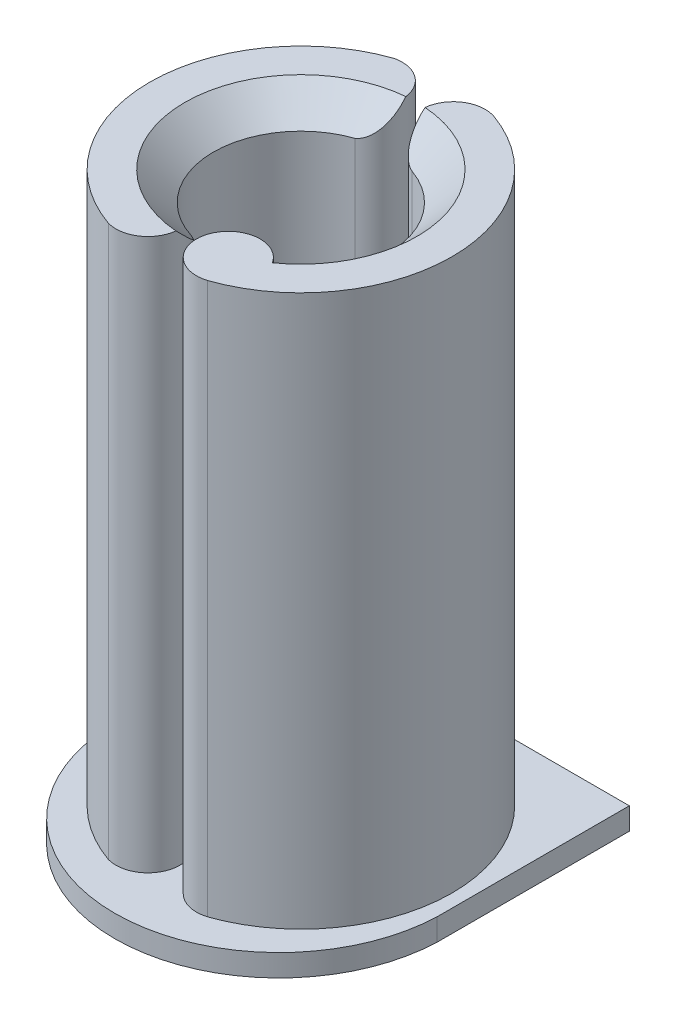
ISO-10303-21;
HEADER;
FILE_DESCRIPTION(('STEP AP214'),'2;1');
FILE_NAME('part.step','',(''),(''),'','','');
FILE_SCHEMA(('AUTOMOTIVE_DESIGN { 1 0 10303 214 1 1 1 1 }'));
ENDSEC;
DATA;
#1=APPLICATION_CONTEXT('core data for automotive mechanical design processes');
#2=APPLICATION_PROTOCOL_DEFINITION('international standard','automotive_design',2000,#1);
#3=PRODUCT_CONTEXT('',#1,'mechanical');
#4=PRODUCT('Part','Part','',(#3));
#5=PRODUCT_RELATED_PRODUCT_CATEGORY('part','',(#4));
#6=PRODUCT_DEFINITION_FORMATION('','',#4);
#7=PRODUCT_DEFINITION_CONTEXT('part definition',#1,'design');
#8=PRODUCT_DEFINITION('design','',#6,#7);
#9=PRODUCT_DEFINITION_SHAPE('','',#8);
#10=(LENGTH_UNIT() NAMED_UNIT(*) SI_UNIT(.MILLI.,.METRE.));
#11=(NAMED_UNIT(*) PLANE_ANGLE_UNIT() SI_UNIT($,.RADIAN.));
#12=(NAMED_UNIT(*) SI_UNIT($,.STERADIAN.) SOLID_ANGLE_UNIT());
#13=UNCERTAINTY_MEASURE_WITH_UNIT(LENGTH_MEASURE(1.E-05),#10,'distance_accuracy_value','');
#14=(GEOMETRIC_REPRESENTATION_CONTEXT(3) GLOBAL_UNCERTAINTY_ASSIGNED_CONTEXT((#13)) GLOBAL_UNIT_ASSIGNED_CONTEXT((#10,
#11,#12)) REPRESENTATION_CONTEXT('',''));
#15=CARTESIAN_POINT('',(0.,0.,0.));
#16=DIRECTION('',(0.,0.,1.));
#17=DIRECTION('',(1.,0.,0.));
#18=AXIS2_PLACEMENT_3D('',#15,#16,#17);
#19=CARTESIAN_POINT('',(0.,0.1,0.0990045452770166));
#20=DIRECTION('',(0.,-1.,0.));
#21=DIRECTION('',(0.,0.,-1.));
#22=AXIS2_PLACEMENT_3D('',#19,#20,#21);
#23=PLANE('',#22);
#24=CARTESIAN_POINT('',(0.181933513168552,0.1,-0.509708023179457));
#25=DIRECTION('',(0.,1.,0.));
#26=DIRECTION('',(0.,0.,1.));
#27=AXIS2_PLACEMENT_3D('',#24,#25,#26);
#28=CIRCLE('',#27,0.144595351835364);
#29=CARTESIAN_POINT('',(0.230541296487319,0.1,-0.645888415208663));
#30=VERTEX_POINT('',#29);
#31=CARTESIAN_POINT('',(0.130138984571206,0.0999999999999998,-0.374707495107262));
#32=VERTEX_POINT('',#31);
#33=EDGE_CURVE('E167',#30,#32,#28,.T.);
#34=ORIENTED_EDGE('',*,*,#33,.F.);
#35=CARTESIAN_POINT('',(0.,0.1,0.));
#36=DIRECTION('',(0.,1.,0.));
#37=DIRECTION('',(0.,0.,1.));
#38=AXIS2_PLACEMENT_3D('',#35,#36,#37);
#39=CIRCLE('',#38,0.68579963129679);
#40=CARTESIAN_POINT('',(0.225000000000004,0.0999999999999998,0.647839589934739));
#41=VERTEX_POINT('',#40);
#42=EDGE_CURVE('E174',#41,#30,#39,.T.);
#43=ORIENTED_EDGE('',*,*,#42,.F.);
#44=CARTESIAN_POINT('',(0.180878906412593,0.1,0.510091196386905));
#45=DIRECTION('',(0.,1.,0.));
#46=DIRECTION('',(0.,0.,-1.));
#47=AXIS2_PLACEMENT_3D('',#44,#45,#46);
#48=CIRCLE('',#47,0.144641940060129);
#49=CARTESIAN_POINT('',(0.136757812825181,0.0999999999999998,0.372342802839072));
#50=VERTEX_POINT('',#49);
#51=EDGE_CURVE('E154',#50,#41,#48,.T.);
#52=ORIENTED_EDGE('',*,*,#51,.F.);
#53=CARTESIAN_POINT('',(0.,0.1,0.));
#54=DIRECTION('',(0.,-1.,0.));
#55=DIRECTION('',(0.,0.,1.));
#56=AXIS2_PLACEMENT_3D('',#53,#54,#55);
#57=CIRCLE('',#56,0.396663411716765);
#58=EDGE_CURVE('E170',#32,#50,#57,.T.);
#59=ORIENTED_EDGE('',*,*,#58,.F.);
#60=EDGE_LOOP('',(#34,#43,#52,#59));
#61=FACE_BOUND('',#60,.T.);
#62=DIRECTION('',(0.,0.,-1.));
#63=VECTOR('',#62,1.);
#64=CARTESIAN_POINT('',(0.745,0.1,0.127313196762528));
#65=LINE('',#64,#63);
#66=CARTESIAN_POINT('',(0.745,0.1,0.127313196762528));
#67=VERTEX_POINT('',#66);
#68=CARTESIAN_POINT('',(0.745,0.1,-0.745));
#69=VERTEX_POINT('',#68);
#70=EDGE_CURVE('E209',#67,#69,#65,.T.);
#71=ORIENTED_EDGE('',*,*,#70,.T.);
#72=DIRECTION('',(-1.,0.,0.));
#73=VECTOR('',#72,1.);
#74=CARTESIAN_POINT('',(-0.745,0.1,-0.745));
#75=LINE('',#74,#73);
#76=CARTESIAN_POINT('',(-0.745,0.1,-0.745));
#77=VERTEX_POINT('',#76);
#78=EDGE_CURVE('E212',#69,#77,#75,.T.);
#79=ORIENTED_EDGE('',*,*,#78,.T.);
#80=DIRECTION('',(0.,0.,1.));
#81=VECTOR('',#80,1.);
#82=CARTESIAN_POINT('',(-0.745,0.1,0.127313196762528));
#83=LINE('',#82,#81);
#84=CARTESIAN_POINT('',(-0.745,0.1,0.127313196762528));
#85=VERTEX_POINT('',#84);
#86=EDGE_CURVE('E215',#77,#85,#83,.T.);
#87=ORIENTED_EDGE('',*,*,#86,.T.);
#88=CARTESIAN_POINT('',(0.,0.1,0.0990045452770166));
#89=DIRECTION('',(0.,1.,0.));
#90=DIRECTION('',(0.,0.,-1.));
#91=AXIS2_PLACEMENT_3D('',#88,#89,#90);
#92=CIRCLE('',#91,0.745537644756405);
#93=EDGE_CURVE('E217',#85,#67,#92,.T.);
#94=ORIENTED_EDGE('',*,*,#93,.T.);
#95=EDGE_LOOP('',(#71,#79,#87,#94));
#96=FACE_BOUND('',#95,.T.);
#97=CARTESIAN_POINT('',(-0.192449470211755,0.1,-0.506105604214357));
#98=DIRECTION('',(0.,1.,0.));
#99=DIRECTION('',(0.,0.,-1.));
#100=AXIS2_PLACEMENT_3D('',#97,#98,#99);
#101=CIRCLE('',#100,0.1454237246727);
#102=CARTESIAN_POINT('',(-0.130138984571207,0.1,-0.374707495107262));
#103=VERTEX_POINT('',#102);
#104=CARTESIAN_POINT('',(-0.225,0.0999999999999998,-0.64783958993474));
#105=VERTEX_POINT('',#104);
#106=EDGE_CURVE('E179',#103,#105,#101,.T.);
#107=ORIENTED_EDGE('',*,*,#106,.F.);
#108=CARTESIAN_POINT('',(0.,0.1,0.));
#109=DIRECTION('',(0.,-1.,0.));
#110=DIRECTION('',(0.,0.,1.));
#111=AXIS2_PLACEMENT_3D('',#108,#109,#110);
#112=CIRCLE('',#111,0.396663411716765);
#113=CARTESIAN_POINT('',(-0.120195023231292,0.0999999999999998,0.378014574567189));
#114=VERTEX_POINT('',#113);
#115=EDGE_CURVE('E183',#114,#103,#112,.T.);
#116=ORIENTED_EDGE('',*,*,#115,.F.);
#117=CARTESIAN_POINT('',(-0.186033792941878,0.1,0.507708184550411));
#118=DIRECTION('',(0.,1.,0.));
#119=DIRECTION('',(0.,0.,1.));
#120=AXIS2_PLACEMENT_3D('',#117,#118,#119);
#121=CIRCLE('',#120,0.145448190320415);
#122=CARTESIAN_POINT('',(-0.225,0.0999999999999998,0.64783958993474));
#123=VERTEX_POINT('',#122);
#124=EDGE_CURVE('E194',#123,#114,#121,.T.);
#125=ORIENTED_EDGE('',*,*,#124,.F.);
#126=CARTESIAN_POINT('',(0.,0.1,0.));
#127=DIRECTION('',(0.,1.,0.));
#128=DIRECTION('',(0.,0.,1.));
#129=AXIS2_PLACEMENT_3D('',#126,#127,#128);
#130=CIRCLE('',#129,0.68579963129679);
#131=EDGE_CURVE('E191',#105,#123,#130,.T.);
#132=ORIENTED_EDGE('',*,*,#131,.F.);
#133=EDGE_LOOP('',(#107,#116,#125,#132));
#134=FACE_BOUND('',#133,.T.);
#135=ADVANCED_FACE('F34',(#61,#96,#134),#23,.F.);
#136=CARTESIAN_POINT('',(0.745,0.1,0.127313196762528));
#137=DIRECTION('',(-1.,0.,0.));
#138=DIRECTION('',(0.,0.,1.));
#139=AXIS2_PLACEMENT_3D('',#136,#137,#138);
#140=PLANE('',#139);
#141=DIRECTION('',(0.,0.,-1.));
#142=VECTOR('',#141,1.);
#143=CARTESIAN_POINT('',(0.745,0.,0.127313196762528));
#144=LINE('',#143,#142);
#145=CARTESIAN_POINT('',(0.745,0.,0.127313196762528));
#146=VERTEX_POINT('',#145);
#147=CARTESIAN_POINT('',(0.745,0.,-0.745));
#148=VERTEX_POINT('',#147);
#149=EDGE_CURVE('E208',#146,#148,#144,.T.);
#150=ORIENTED_EDGE('',*,*,#149,.T.);
#151=DIRECTION('',(0.,-1.,0.));
#152=VECTOR('',#151,1.);
#153=CARTESIAN_POINT('',(0.745,0.1,-0.745));
#154=LINE('',#153,#152);
#155=EDGE_CURVE('E235',#69,#148,#154,.T.);
#156=ORIENTED_EDGE('',*,*,#155,.F.);
#157=ORIENTED_EDGE('',*,*,#70,.F.);
#158=DIRECTION('',(0.,-1.,0.));
#159=VECTOR('',#158,1.);
#160=CARTESIAN_POINT('',(0.745,0.1,0.127313196762528));
#161=LINE('',#160,#159);
#162=EDGE_CURVE('E219',#67,#146,#161,.T.);
#163=ORIENTED_EDGE('',*,*,#162,.T.);
#164=EDGE_LOOP('',(#150,#156,#157,#163));
#165=FACE_BOUND('',#164,.T.);
#166=ADVANCED_FACE('F264',(#165),#140,.F.);
#167=CARTESIAN_POINT('',(-0.745,0.1,-0.745));
#168=DIRECTION('',(0.,0.,1.));
#169=DIRECTION('',(1.,0.,0.));
#170=AXIS2_PLACEMENT_3D('',#167,#168,#169);
#171=PLANE('',#170);
#172=DIRECTION('',(-1.,0.,0.));
#173=VECTOR('',#172,1.);
#174=CARTESIAN_POINT('',(-0.745,0.,-0.745));
#175=LINE('',#174,#173);
#176=CARTESIAN_POINT('',(-0.745,0.,-0.745));
#177=VERTEX_POINT('',#176);
#178=EDGE_CURVE('E222',#148,#177,#175,.T.);
#179=ORIENTED_EDGE('',*,*,#178,.T.);
#180=DIRECTION('',(0.,-1.,0.));
#181=VECTOR('',#180,1.);
#182=CARTESIAN_POINT('',(-0.745,0.1,-0.745));
#183=LINE('',#182,#181);
#184=EDGE_CURVE('E232',#77,#177,#183,.T.);
#185=ORIENTED_EDGE('',*,*,#184,.F.);
#186=ORIENTED_EDGE('',*,*,#78,.F.);
#187=ORIENTED_EDGE('',*,*,#155,.T.);
#188=EDGE_LOOP('',(#179,#185,#186,#187));
#189=FACE_BOUND('',#188,.T.);
#190=ADVANCED_FACE('F276',(#189),#171,.F.);
#191=CARTESIAN_POINT('',(-0.745,0.1,0.127313196762528));
#192=DIRECTION('',(1.,0.,0.));
#193=DIRECTION('',(0.,0.,-1.));
#194=AXIS2_PLACEMENT_3D('',#191,#192,#193);
#195=PLANE('',#194);
#196=DIRECTION('',(0.,0.,1.));
#197=VECTOR('',#196,1.);
#198=CARTESIAN_POINT('',(-0.745,0.,0.127313196762528));
#199=LINE('',#198,#197);
#200=CARTESIAN_POINT('',(-0.745,0.,0.127313196762528));
#201=VERTEX_POINT('',#200);
#202=EDGE_CURVE('E224',#177,#201,#199,.T.);
#203=ORIENTED_EDGE('',*,*,#202,.T.);
#204=DIRECTION('',(0.,-1.,0.));
#205=VECTOR('',#204,1.);
#206=CARTESIAN_POINT('',(-0.745,0.1,0.127313196762528));
#207=LINE('',#206,#205);
#208=EDGE_CURVE('E229',#85,#201,#207,.T.);
#209=ORIENTED_EDGE('',*,*,#208,.F.);
#210=ORIENTED_EDGE('',*,*,#86,.F.);
#211=ORIENTED_EDGE('',*,*,#184,.T.);
#212=EDGE_LOOP('',(#203,#209,#210,#211));
#213=FACE_BOUND('',#212,.T.);
#214=ADVANCED_FACE('F272',(#213),#195,.F.);
#215=CARTESIAN_POINT('',(0.,0.1,0.0990045452770166));
#216=DIRECTION('',(0.,-1.,0.));
#217=DIRECTION('',(0.,0.,-1.));
#218=AXIS2_PLACEMENT_3D('',#215,#216,#217);
#219=CYLINDRICAL_SURFACE('',#218,0.745537644756405);
#220=CARTESIAN_POINT('',(0.,0.,0.0990045452770166));
#221=DIRECTION('',(0.,1.,0.));
#222=DIRECTION('',(0.,0.,-1.));
#223=AXIS2_PLACEMENT_3D('',#220,#221,#222);
#224=CIRCLE('',#223,0.745537644756405);
#225=EDGE_CURVE('E213',#201,#146,#224,.T.);
#226=ORIENTED_EDGE('',*,*,#225,.T.);
#227=ORIENTED_EDGE('',*,*,#162,.F.);
#228=ORIENTED_EDGE('',*,*,#93,.F.);
#229=ORIENTED_EDGE('',*,*,#208,.T.);
#230=EDGE_LOOP('',(#226,#227,#228,#229));
#231=FACE_BOUND('',#230,.T.);
#232=ADVANCED_FACE('F268',(#231),#219,.T.);
#233=CARTESIAN_POINT('',(0.,0.,0.0990045452770166));
#234=DIRECTION('',(0.,-1.,0.));
#235=DIRECTION('',(0.,0.,-1.));
#236=AXIS2_PLACEMENT_3D('',#233,#234,#235);
#237=PLANE('',#236);
#238=ORIENTED_EDGE('',*,*,#149,.F.);
#239=ORIENTED_EDGE('',*,*,#225,.F.);
#240=ORIENTED_EDGE('',*,*,#202,.F.);
#241=ORIENTED_EDGE('',*,*,#178,.F.);
#242=EDGE_LOOP('',(#238,#239,#240,#241));
#243=FACE_BOUND('',#242,.T.);
#244=ADVANCED_FACE('F259',(#243),#237,.T.);
#245=CARTESIAN_POINT('',(-0.192449470211755,2.6,-0.506105604214357));
#246=DIRECTION('',(0.,-1.,0.));
#247=DIRECTION('',(0.,0.,-1.));
#248=AXIS2_PLACEMENT_3D('',#245,#246,#247);
#249=CYLINDRICAL_SURFACE('',#248,0.1454237246727);
#250=CARTESIAN_POINT('',(-0.192449470211755,2.6,-0.506105604214357));
#251=DIRECTION('',(0.,1.,0.));
#252=DIRECTION('',(0.,0.,-1.));
#253=AXIS2_PLACEMENT_3D('',#250,#251,#252);
#254=CIRCLE('',#253,0.1454237246727);
#255=CARTESIAN_POINT('',(-0.0481879489078253,2.6,-0.524454259989562));
#256=VERTEX_POINT('',#255);
#257=CARTESIAN_POINT('',(-0.225,2.6,-0.64783958993474));
#258=VERTEX_POINT('',#257);
#259=EDGE_CURVE('E180',#256,#258,#254,.T.);
#260=ORIENTED_EDGE('',*,*,#259,.F.);
#261=CARTESIAN_POINT('',(-0.0481879489078253,2.6,-0.524454259989562));
#262=CARTESIAN_POINT('',(-0.0468113824389066,2.58884809631623,-0.513349456598553));
#263=CARTESIAN_POINT('',(-0.046651874035208,2.57759807362688,-0.502094265838497));
#264=CARTESIAN_POINT('',(-0.0490197110508591,2.55528063647417,-0.479459860878492));
#265=CARTESIAN_POINT('',(-0.0515754662528383,2.54421640782423,-0.468080592893677));
#266=CARTESIAN_POINT('',(-0.0580748725628018,2.52709764342816,-0.450039322379565));
#267=CARTESIAN_POINT('',(-0.0610770906540231,2.52078452191212,-0.443282515272577));
#268=CARTESIAN_POINT('',(-0.0683161363456795,2.50867707231127,-0.429971617518339));
#269=CARTESIAN_POINT('',(-0.0725502634742349,2.50288164532439,-0.423417117788652));
#270=CARTESIAN_POINT('',(-0.0810214041522569,2.49368072596869,-0.412483922962882));
#271=CARTESIAN_POINT('',(-0.0849139458669119,2.4900647346156,-0.408017339930513));
#272=CARTESIAN_POINT('',(-0.0934748798408047,2.48348479400758,-0.399387099754529));
#273=CARTESIAN_POINT('',(-0.0981394763147642,2.4805178119163,-0.395222097229538));
#274=CARTESIAN_POINT('',(-0.107203956174331,2.47602055561671,-0.388179109115445));
#275=CARTESIAN_POINT('',(-0.111450028382899,2.47431901777294,-0.385215547492988));
#276=CARTESIAN_POINT('',(-0.12044007758109,2.47159769773367,-0.379648642830556));
#277=CARTESIAN_POINT('',(-0.125189026335204,2.47058563600767,-0.377049629820146));
#278=CARTESIAN_POINT('',(-0.130138984571207,2.47,-0.374707495107262));
#279=B_SPLINE_CURVE_WITH_KNOTS('',3,(#261,#262,#263,#264,#265,#266,#267,#268,#269,#270,#271,
#272,#273,#274,#275,#276,#277,#278),.UNSPECIFIED.,.F.,.F.,(4,2,2,2,2,2,2,2,4),(0.,
0.0474622286653903,0.0954259904776514,0.124522262061889,0.153555226078874,0.17431701331885,
0.194979603103086,0.21125829110688,0.227716390323622),.UNSPECIFIED.);
#280=CARTESIAN_POINT('',(-0.130138984571207,2.47,-0.374707495107262));
#281=VERTEX_POINT('',#280);
#282=EDGE_CURVE('E241',#256,#281,#279,.T.);
#283=ORIENTED_EDGE('',*,*,#282,.T.);
#284=DIRECTION('',(0.,-1.,0.));
#285=VECTOR('',#284,1.);
#286=CARTESIAN_POINT('',(-0.130138984571207,2.6,-0.374707495107262));
#287=LINE('',#286,#285);
#288=EDGE_CURVE('E188',#281,#103,#287,.T.);
#289=ORIENTED_EDGE('',*,*,#288,.T.);
#290=ORIENTED_EDGE('',*,*,#106,.T.);
#291=DIRECTION('',(0.,-1.,0.));
#292=VECTOR('',#291,1.);
#293=CARTESIAN_POINT('',(-0.225,2.6,-0.64783958993474));
#294=LINE('',#293,#292);
#295=EDGE_CURVE('E205',#258,#105,#294,.T.);
#296=ORIENTED_EDGE('',*,*,#295,.F.);
#297=EDGE_LOOP('',(#260,#283,#289,#290,#296));
#298=FACE_BOUND('',#297,.T.);
#299=ADVANCED_FACE('F253',(#298),#249,.T.);
#300=CARTESIAN_POINT('',(0.,2.6,0.));
#301=DIRECTION('',(0.,-1.,0.));
#302=DIRECTION('',(0.,0.,-1.));
#303=AXIS2_PLACEMENT_3D('',#300,#301,#302);
#304=CYLINDRICAL_SURFACE('',#303,0.68579963129679);
#305=ORIENTED_EDGE('',*,*,#131,.T.);
#306=DIRECTION('',(0.,-1.,0.));
#307=VECTOR('',#306,1.);
#308=CARTESIAN_POINT('',(-0.225,2.6,0.64783958993474));
#309=LINE('',#308,#307);
#310=CARTESIAN_POINT('',(-0.225,2.6,0.64783958993474));
#311=VERTEX_POINT('',#310);
#312=EDGE_CURVE('E202',#311,#123,#309,.T.);
#313=ORIENTED_EDGE('',*,*,#312,.F.);
#314=CARTESIAN_POINT('',(0.,2.6,0.));
#315=DIRECTION('',(0.,1.,0.));
#316=DIRECTION('',(0.,0.,1.));
#317=AXIS2_PLACEMENT_3D('',#314,#315,#316);
#318=CIRCLE('',#317,0.68579963129679);
#319=EDGE_CURVE('E182',#258,#311,#318,.T.);
#320=ORIENTED_EDGE('',*,*,#319,.F.);
#321=ORIENTED_EDGE('',*,*,#295,.T.);
#322=EDGE_LOOP('',(#305,#313,#320,#321));
#323=FACE_BOUND('',#322,.T.);
#324=ADVANCED_FACE('F258',(#323),#304,.T.);
#325=CARTESIAN_POINT('',(-0.186033792941878,2.6,0.507708184550411));
#326=DIRECTION('',(0.,-1.,0.));
#327=DIRECTION('',(0.,0.,-1.));
#328=AXIS2_PLACEMENT_3D('',#325,#326,#327);
#329=CYLINDRICAL_SURFACE('',#328,0.145448190320415);
#330=DIRECTION('',(0.,-1.,0.));
#331=VECTOR('',#330,1.);
#332=CARTESIAN_POINT('',(-0.120195023231292,2.6,0.378014574567189));
#333=LINE('',#332,#331);
#334=CARTESIAN_POINT('',(-0.120195023231292,2.47,0.378014574567189));
#335=VERTEX_POINT('',#334);
#336=EDGE_CURVE('E200',#335,#114,#333,.T.);
#337=ORIENTED_EDGE('',*,*,#336,.F.);
#338=CARTESIAN_POINT('',(-0.120195023231292,2.47,0.378014574567189));
#339=CARTESIAN_POINT('',(-0.114052153159112,2.47110298514331,0.381127827107212));
#340=CARTESIAN_POINT('',(-0.108282690881142,2.47284977598417,0.384609048688318));
#341=CARTESIAN_POINT('',(-0.0976092900010662,2.47730731444981,0.392047193502122));
#342=CARTESIAN_POINT('',(-0.0926930042822843,2.4800022279407,0.395995635239962));
#343=CARTESIAN_POINT('',(-0.0824614481164727,2.48688305309949,0.405297706031217));
#344=CARTESIAN_POINT('',(-0.077379183991403,2.49127461906525,0.410748436956359));
#345=CARTESIAN_POINT('',(-0.0683069914917714,2.5007821979017,0.421987436870435));
#346=CARTESIAN_POINT('',(-0.0643255708396699,2.50590341362188,0.427777937206202));
#347=CARTESIAN_POINT('',(-0.0555734362158072,2.51933650289779,0.442572039270886));
#348=CARTESIAN_POINT('',(-0.0514501924760384,2.52793455863402,0.451696276653454));
#349=CARTESIAN_POINT('',(-0.0451907047431163,2.54560755524993,0.470120714153125));
#350=CARTESIAN_POINT('',(-0.0430536828834744,2.55468230796786,0.479420843928045));
#351=CARTESIAN_POINT('',(-0.0410292890548282,2.56984273003144,0.494809596541437));
#352=CARTESIAN_POINT('',(-0.0406182415893711,2.57587135560741,0.500891250467211));
#353=CARTESIAN_POINT('',(-0.0405569645383898,2.58793619090077,0.512998741690067));
#354=CARTESIAN_POINT('',(-0.040903443657669,2.59397225438052,0.519024706667983));
#355=CARTESIAN_POINT('',(-0.0416191038269021,2.6,0.525016380161408));
#356=B_SPLINE_CURVE_WITH_KNOTS('',3,(#338,#339,#340,#341,#342,#343,#344,#345,#346,#347,#348,
#349,#350,#351,#352,#353,#354,#355),.UNSPECIFIED.,.F.,.F.,(4,2,2,2,2,2,2,2,4),(0.,
0.0207839810619698,0.0412361593253994,0.0670474358072767,0.0930529445640032,0.132435447223801,
0.171802519959302,0.197490518209206,0.223067129332136),.UNSPECIFIED.);
#357=CARTESIAN_POINT('',(-0.0416191038269021,2.6,0.525016380161408));
#358=VERTEX_POINT('',#357);
#359=EDGE_CURVE('E308',#335,#358,#356,.T.);
#360=ORIENTED_EDGE('',*,*,#359,.T.);
#361=CARTESIAN_POINT('',(-0.186033792941878,2.6,0.507708184550411));
#362=DIRECTION('',(0.,1.,0.));
#363=DIRECTION('',(0.,0.,1.));
#364=AXIS2_PLACEMENT_3D('',#361,#362,#363);
#365=CIRCLE('',#364,0.145448190320415);
#366=EDGE_CURVE('E185',#311,#358,#365,.T.);
#367=ORIENTED_EDGE('',*,*,#366,.F.);
#368=ORIENTED_EDGE('',*,*,#312,.T.);
#369=ORIENTED_EDGE('',*,*,#124,.T.);
#370=EDGE_LOOP('',(#337,#360,#367,#368,#369));
#371=FACE_BOUND('',#370,.T.);
#372=ADVANCED_FACE('F306',(#371),#329,.T.);
#373=CARTESIAN_POINT('',(0.,2.6,0.));
#374=DIRECTION('',(0.,-1.,0.));
#375=DIRECTION('',(0.,0.,-1.));
#376=AXIS2_PLACEMENT_3D('',#373,#374,#375);
#377=CYLINDRICAL_SURFACE('',#376,0.396663411716765);
#378=ORIENTED_EDGE('',*,*,#288,.F.);
#379=CARTESIAN_POINT('',(0.,2.47,0.));
#380=DIRECTION('',(0.,-1.,0.));
#381=DIRECTION('',(0.,0.,-1.));
#382=AXIS2_PLACEMENT_3D('',#379,#380,#381);
#383=CIRCLE('',#382,0.396663411716765);
#384=EDGE_CURVE('E248',#281,#335,#383,.F.);
#385=ORIENTED_EDGE('',*,*,#384,.T.);
#386=ORIENTED_EDGE('',*,*,#336,.T.);
#387=ORIENTED_EDGE('',*,*,#115,.T.);
#388=EDGE_LOOP('',(#378,#385,#386,#387));
#389=FACE_BOUND('',#388,.T.);
#390=ADVANCED_FACE('F301',(#389),#377,.F.);
#391=CARTESIAN_POINT('',(-0.0962247351058775,2.6,-0.253052802107179));
#392=DIRECTION('',(0.,-1.,0.));
#393=DIRECTION('',(0.,0.,-1.));
#394=AXIS2_PLACEMENT_3D('',#391,#392,#393);
#395=PLANE('',#394);
#396=ORIENTED_EDGE('',*,*,#366,.T.);
#397=CARTESIAN_POINT('',(0.,2.6,0.));
#398=DIRECTION('',(0.,-1.,0.));
#399=DIRECTION('',(0.,0.,-1.));
#400=AXIS2_PLACEMENT_3D('',#397,#398,#399);
#401=CIRCLE('',#400,0.526663411716765);
#402=EDGE_CURVE('E238',#358,#256,#401,.T.);
#403=ORIENTED_EDGE('',*,*,#402,.T.);
#404=ORIENTED_EDGE('',*,*,#259,.T.);
#405=ORIENTED_EDGE('',*,*,#319,.T.);
#406=EDGE_LOOP('',(#396,#403,#404,#405));
#407=FACE_BOUND('',#406,.T.);
#408=ADVANCED_FACE('F322',(#407),#395,.F.);
#409=CARTESIAN_POINT('',(0.181933513168552,2.6,-0.509708023179457));
#410=DIRECTION('',(0.,-1.,0.));
#411=DIRECTION('',(0.,0.,-1.));
#412=AXIS2_PLACEMENT_3D('',#409,#410,#411);
#413=CYLINDRICAL_SURFACE('',#412,0.144595351835364);
#414=DIRECTION('',(0.,-1.,0.));
#415=VECTOR('',#414,1.);
#416=CARTESIAN_POINT('',(0.130138984571206,2.6,-0.374707495107262));
#417=LINE('',#416,#415);
#418=CARTESIAN_POINT('',(0.130138984571206,2.47,-0.374707495107262));
#419=VERTEX_POINT('',#418);
#420=EDGE_CURVE('E177',#419,#32,#417,.T.);
#421=ORIENTED_EDGE('',*,*,#420,.F.);
#422=CARTESIAN_POINT('',(0.130138984571206,2.47,-0.374707495107262));
#423=CARTESIAN_POINT('',(0.12434889210717,2.47018165213305,-0.376917584674864));
#424=CARTESIAN_POINT('',(0.118760310354285,2.47093813951965,-0.379498869807198));
#425=CARTESIAN_POINT('',(0.108183921731321,2.47339422824173,-0.385194889781053));
#426=CARTESIAN_POINT('',(0.103188757631626,2.47508038699691,-0.388301593394116));
#427=CARTESIAN_POINT('',(0.0938589630864294,2.47919104310815,-0.394888758853906));
#428=CARTESIAN_POINT('',(0.0895200559172997,2.48161042114231,-0.398366524203718));
#429=CARTESIAN_POINT('',(0.081439837488211,2.48700614353651,-0.405600917670387));
#430=CARTESIAN_POINT('',(0.0777009852997231,2.48998467642714,-0.409358605302374));
#431=CARTESIAN_POINT('',(0.0684947106709694,2.49846502222207,-0.419630182300225));
#432=CARTESIAN_POINT('',(0.0635407550886215,2.50432338860623,-0.426308592195388));
#433=CARTESIAN_POINT('',(0.0550231042896109,2.5166832472287,-0.439948648534949));
#434=CARTESIAN_POINT('',(0.0514631632648259,2.52318641782063,-0.446911004813412));
#435=CARTESIAN_POINT('',(0.0442165750405,2.53965480909225,-0.464249031244205));
#436=CARTESIAN_POINT('',(0.0412305208158479,2.54983201123458,-0.474716263513771));
#437=CARTESIAN_POINT('',(0.0376237174156314,2.57047631176065,-0.495720447852139));
#438=CARTESIAN_POINT('',(0.0369993629989501,2.58094294369018,-0.506257269035531));
#439=CARTESIAN_POINT('',(0.037647233659945,2.59427571773224,-0.519576710475071));
#440=CARTESIAN_POINT('',(0.0378711269388299,2.59713928488338,-0.522431380974029));
#441=CARTESIAN_POINT('',(0.038178864149872,2.6,-0.525277758498651));
#442=B_SPLINE_CURVE_WITH_KNOTS('',3,(#422,#423,#424,#425,#426,#427,#428,#429,#430,#431,#432,
#433,#434,#435,#436,#437,#438,#439,#440,#441),.UNSPECIFIED.,.F.,.F.,(4,2,2,2,2,2,2,2,2,4),(0.,
0.0185050415963094,0.0367492719269501,0.054868946598638,0.0730610789155196,0.10340436486666,
0.133828814754669,0.178302462998467,0.222708192752617,0.234853049338382),.UNSPECIFIED.);
#443=CARTESIAN_POINT('',(0.0381788641498753,2.6,-0.525277758498651));
#444=VERTEX_POINT('',#443);
#445=EDGE_CURVE('E48',#419,#444,#442,.T.);
#446=ORIENTED_EDGE('',*,*,#445,.T.);
#447=CARTESIAN_POINT('',(0.181933513168552,2.6,-0.509708023179457));
#448=DIRECTION('',(0.,1.,0.));
#449=DIRECTION('',(0.,0.,1.));
#450=AXIS2_PLACEMENT_3D('',#447,#448,#449);
#451=CIRCLE('',#450,0.144595351835364);
#452=CARTESIAN_POINT('',(0.230541296487319,2.6,-0.645888415208663));
#453=VERTEX_POINT('',#452);
#454=EDGE_CURVE('E147',#453,#444,#451,.T.);
#455=ORIENTED_EDGE('',*,*,#454,.F.);
#456=DIRECTION('',(0.,-1.,0.));
#457=VECTOR('',#456,1.);
#458=CARTESIAN_POINT('',(0.230541296487319,2.6,-0.645888415208663));
#459=LINE('',#458,#457);
#460=EDGE_CURVE('E158',#453,#30,#459,.T.);
#461=ORIENTED_EDGE('',*,*,#460,.T.);
#462=ORIENTED_EDGE('',*,*,#33,.T.);
#463=EDGE_LOOP('',(#421,#446,#455,#461,#462));
#464=FACE_BOUND('',#463,.T.);
#465=ADVANCED_FACE('F325',(#464),#413,.T.);
#466=CARTESIAN_POINT('',(0.,2.6,0.));
#467=DIRECTION('',(0.,-1.,0.));
#468=DIRECTION('',(0.,0.,-1.));
#469=AXIS2_PLACEMENT_3D('',#466,#467,#468);
#470=CYLINDRICAL_SURFACE('',#469,0.396663411716765);
#471=DIRECTION('',(0.,-1.,0.));
#472=VECTOR('',#471,1.);
#473=CARTESIAN_POINT('',(0.136757812825181,2.6,0.372342802839072));
#474=LINE('',#473,#472);
#475=CARTESIAN_POINT('',(0.136757812825181,2.47,0.372342802839072));
#476=VERTEX_POINT('',#475);
#477=EDGE_CURVE('E157',#476,#50,#474,.T.);
#478=ORIENTED_EDGE('',*,*,#477,.F.);
#479=CARTESIAN_POINT('',(0.,2.47,0.));
#480=DIRECTION('',(0.,1.,0.));
#481=DIRECTION('',(0.,0.,1.));
#482=AXIS2_PLACEMENT_3D('',#479,#480,#481);
#483=CIRCLE('',#482,0.396663411716765);
#484=EDGE_CURVE('E55',#476,#419,#483,.T.);
#485=ORIENTED_EDGE('',*,*,#484,.T.);
#486=ORIENTED_EDGE('',*,*,#420,.T.);
#487=ORIENTED_EDGE('',*,*,#58,.T.);
#488=EDGE_LOOP('',(#478,#485,#486,#487));
#489=FACE_BOUND('',#488,.T.);
#490=ADVANCED_FACE('F330',(#489),#470,.F.);
#491=CARTESIAN_POINT('',(0.180878906412593,2.6,0.510091196386905));
#492=DIRECTION('',(0.,-1.,0.));
#493=DIRECTION('',(0.,0.,-1.));
#494=AXIS2_PLACEMENT_3D('',#491,#492,#493);
#495=CYLINDRICAL_SURFACE('',#494,0.144641940060129);
#496=ORIENTED_EDGE('',*,*,#51,.T.);
#497=DIRECTION('',(0.,-1.,0.));
#498=VECTOR('',#497,1.);
#499=CARTESIAN_POINT('',(0.225000000000004,2.6,0.647839589934739));
#500=LINE('',#499,#498);
#501=CARTESIAN_POINT('',(0.225000000000004,2.6,0.647839589934739));
#502=VERTEX_POINT('',#501);
#503=EDGE_CURVE('E151',#502,#41,#500,.T.);
#504=ORIENTED_EDGE('',*,*,#503,.F.);
#505=CARTESIAN_POINT('',(0.180878906412593,2.6,0.510091196386905));
#506=DIRECTION('',(0.,1.,0.));
#507=DIRECTION('',(0.,0.,-1.));
#508=AXIS2_PLACEMENT_3D('',#505,#506,#507);
#509=CIRCLE('',#508,0.144641940060129);
#510=CARTESIAN_POINT('',(0.30219965014957,2.6,0.431334812750628));
#511=VERTEX_POINT('',#510);
#512=EDGE_CURVE('E138',#511,#502,#509,.T.);
#513=ORIENTED_EDGE('',*,*,#512,.F.);
#514=CARTESIAN_POINT('',(0.30219965014957,2.6,0.431334812750628));
#515=CARTESIAN_POINT('',(0.296112097899592,2.58891150185453,0.422021855231572));
#516=CARTESIAN_POINT('',(0.289004392218376,2.57772560669846,0.413376574853758));
#517=CARTESIAN_POINT('',(0.272663906074469,2.55552373956304,0.397710028216974));
#518=CARTESIAN_POINT('',(0.263407620531995,2.54451120249715,0.390708587697883));
#519=CARTESIAN_POINT('',(0.246862232573202,2.52745918607363,0.381176192030798));
#520=CARTESIAN_POINT('',(0.240225751217426,2.52116346708005,0.377968945739819));
#521=CARTESIAN_POINT('',(0.226150713262131,2.50909628526385,0.372509719113924));
#522=CARTESIAN_POINT('',(0.218714883392312,2.5033231566143,0.370254612925294));
#523=CARTESIAN_POINT('',(0.205252152550805,2.49416318771134,0.367402572211822));
#524=CARTESIAN_POINT('',(0.199430960407667,2.49056623001332,0.366515802193746));
#525=CARTESIAN_POINT('',(0.187372146438526,2.48400686681141,0.365468920809207));
#526=CARTESIAN_POINT('',(0.181135015529317,2.48104373003009,0.365307967669196));
#527=CARTESIAN_POINT('',(0.169798220591985,2.47658925871363,0.365789485876527));
#528=CARTESIAN_POINT('',(0.164763313424454,2.47491639829672,0.366257199782206));
#529=CARTESIAN_POINT('',(0.154606943788388,2.47224655753285,0.367763595359492));
#530=CARTESIAN_POINT('',(0.14948578200413,2.47124758913912,0.368800581060554));
#531=CARTESIAN_POINT('',(0.141839154675541,2.47032225089977,0.370791649178978));
#532=CARTESIAN_POINT('',(0.139288992239223,2.47010954130599,0.371530641158122));
#533=CARTESIAN_POINT('',(0.136757812825181,2.47,0.372342802839072));
#534=B_SPLINE_CURVE_WITH_KNOTS('',3,(#514,#515,#516,#517,#518,#519,#520,#521,#522,#523,#524,
#525,#526,#527,#528,#529,#530,#531,#532,#533),.UNSPECIFIED.,.F.,.F.,(4,2,2,2,2,2,2,2,2,4),(0.,
0.0471917619615987,0.0949263907088552,0.123936426396345,0.152850467989179,0.173490608982779,
0.194106806195092,0.210024101848476,0.225894232146162,0.233874420602501),.UNSPECIFIED.);
#535=EDGE_CURVE('E11',#511,#476,#534,.T.);
#536=ORIENTED_EDGE('',*,*,#535,.T.);
#537=ORIENTED_EDGE('',*,*,#477,.T.);
#538=EDGE_LOOP('',(#496,#504,#513,#536,#537));
#539=FACE_BOUND('',#538,.T.);
#540=ADVANCED_FACE('F152',(#539),#495,.T.);
#541=CARTESIAN_POINT('',(0.,2.6,0.));
#542=DIRECTION('',(0.,-1.,0.));
#543=DIRECTION('',(0.,0.,-1.));
#544=AXIS2_PLACEMENT_3D('',#541,#542,#543);
#545=CYLINDRICAL_SURFACE('',#544,0.68579963129679);
#546=ORIENTED_EDGE('',*,*,#42,.T.);
#547=ORIENTED_EDGE('',*,*,#460,.F.);
#548=CARTESIAN_POINT('',(0.,2.6,0.));
#549=DIRECTION('',(0.,1.,0.));
#550=DIRECTION('',(0.,0.,1.));
#551=AXIS2_PLACEMENT_3D('',#548,#549,#550);
#552=CIRCLE('',#551,0.68579963129679);
#553=EDGE_CURVE('E143',#502,#453,#552,.T.);
#554=ORIENTED_EDGE('',*,*,#553,.F.);
#555=ORIENTED_EDGE('',*,*,#503,.T.);
#556=EDGE_LOOP('',(#546,#547,#554,#555));
#557=FACE_BOUND('',#556,.T.);
#558=ADVANCED_FACE('F160',(#557),#545,.T.);
#559=CARTESIAN_POINT('',(0.0909667565842758,2.6,-0.254854011589728));
#560=DIRECTION('',(0.,1.,0.));
#561=DIRECTION('',(0.,0.,1.));
#562=AXIS2_PLACEMENT_3D('',#559,#560,#561);
#563=PLANE('',#562);
#564=ORIENTED_EDGE('',*,*,#454,.T.);
#565=CARTESIAN_POINT('',(0.,2.6,0.));
#566=DIRECTION('',(0.,1.,0.));
#567=DIRECTION('',(0.,0.,1.));
#568=AXIS2_PLACEMENT_3D('',#565,#566,#567);
#569=CIRCLE('',#568,0.526663411716764);
#570=EDGE_CURVE('E146',#444,#511,#569,.F.);
#571=ORIENTED_EDGE('',*,*,#570,.T.);
#572=ORIENTED_EDGE('',*,*,#512,.T.);
#573=ORIENTED_EDGE('',*,*,#553,.T.);
#574=EDGE_LOOP('',(#564,#571,#572,#573));
#575=FACE_BOUND('',#574,.T.);
#576=ADVANCED_FACE('F141',(#575),#563,.T.);
#577=CARTESIAN_POINT('',(0.,2.6,0.));
#578=DIRECTION('',(0.,1.,0.));
#579=DIRECTION('',(0.,0.,1.));
#580=AXIS2_PLACEMENT_3D('',#577,#578,#579);
#581=CONICAL_SURFACE('',#580,0.526663411716765,0.785398163397446);
#582=ORIENTED_EDGE('',*,*,#359,.F.);
#583=ORIENTED_EDGE('',*,*,#384,.F.);
#584=ORIENTED_EDGE('',*,*,#282,.F.);
#585=ORIENTED_EDGE('',*,*,#402,.F.);
#586=EDGE_LOOP('',(#582,#583,#584,#585));
#587=FACE_BOUND('',#586,.T.);
#588=ADVANCED_FACE('F250',(#587),#581,.F.);
#589=CARTESIAN_POINT('',(0.,2.6,0.));
#590=DIRECTION('',(0.,1.,0.));
#591=DIRECTION('',(0.,0.,1.));
#592=AXIS2_PLACEMENT_3D('',#589,#590,#591);
#593=CONICAL_SURFACE('',#592,0.526663411716764,0.785398163397445);
#594=ORIENTED_EDGE('',*,*,#445,.F.);
#595=ORIENTED_EDGE('',*,*,#484,.F.);
#596=ORIENTED_EDGE('',*,*,#535,.F.);
#597=ORIENTED_EDGE('',*,*,#570,.F.);
#598=EDGE_LOOP('',(#594,#595,#596,#597));
#599=FACE_BOUND('',#598,.T.);
#600=ADVANCED_FACE('F36',(#599),#593,.F.);
#601=CLOSED_SHELL('',(#135,#166,#190,#214,#232,#244,#299,#324,#372,#390,#408,#465,#490,#540,
#558,#576,#588,#600));
#602=MANIFOLD_SOLID_BREP('B2',#601);
#603=ADVANCED_BREP_SHAPE_REPRESENTATION('',(#18,#602),#14);
#604=SHAPE_DEFINITION_REPRESENTATION(#9,#603);
ENDSEC;
END-ISO-10303-21;
